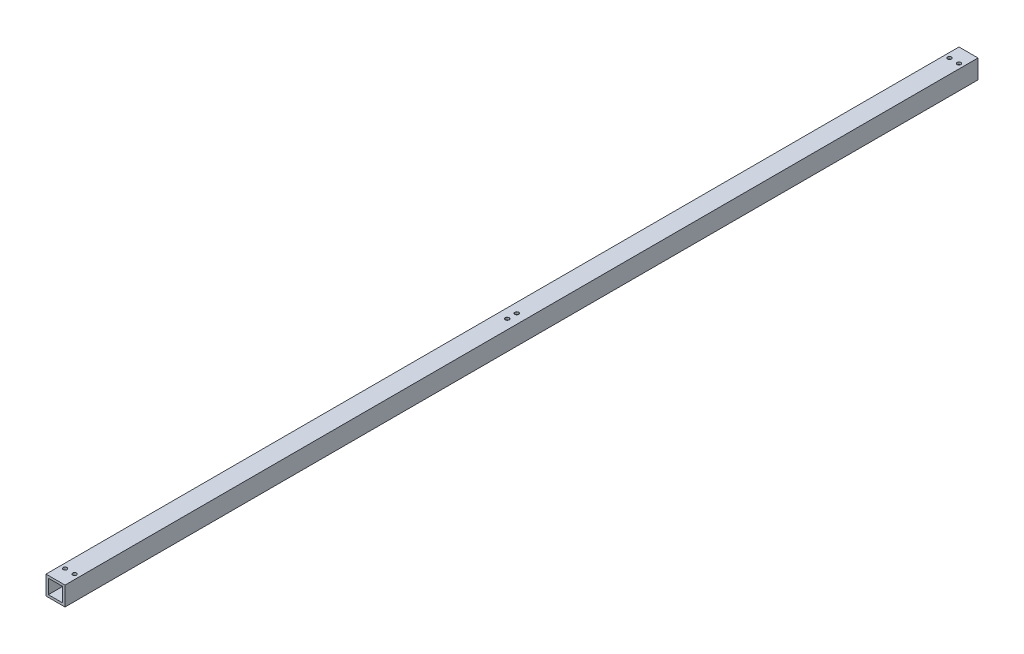
ISO-10303-21;
HEADER;
FILE_DESCRIPTION(('STEP AP214'),'2;1');
FILE_NAME('part.step','',(''),(''),'','','');
FILE_SCHEMA(('AUTOMOTIVE_DESIGN { 1 0 10303 214 1 1 1 1 }'));
ENDSEC;
DATA;
#1=APPLICATION_CONTEXT('core data for automotive mechanical design processes');
#2=APPLICATION_PROTOCOL_DEFINITION('international standard','automotive_design',2000,#1);
#3=PRODUCT_CONTEXT('',#1,'mechanical');
#4=PRODUCT('Part','Part','',(#3));
#5=PRODUCT_RELATED_PRODUCT_CATEGORY('part','',(#4));
#6=PRODUCT_DEFINITION_FORMATION('','',#4);
#7=PRODUCT_DEFINITION_CONTEXT('part definition',#1,'design');
#8=PRODUCT_DEFINITION('design','',#6,#7);
#9=PRODUCT_DEFINITION_SHAPE('','',#8);
#10=(LENGTH_UNIT() NAMED_UNIT(*) SI_UNIT(.MILLI.,.METRE.));
#11=(NAMED_UNIT(*) PLANE_ANGLE_UNIT() SI_UNIT($,.RADIAN.));
#12=(NAMED_UNIT(*) SI_UNIT($,.STERADIAN.) SOLID_ANGLE_UNIT());
#13=UNCERTAINTY_MEASURE_WITH_UNIT(LENGTH_MEASURE(1.E-05),#10,'distance_accuracy_value','');
#14=(GEOMETRIC_REPRESENTATION_CONTEXT(3) GLOBAL_UNCERTAINTY_ASSIGNED_CONTEXT((#13)) GLOBAL_UNIT_ASSIGNED_CONTEXT((#10,
#11,#12)) REPRESENTATION_CONTEXT('',''));
#15=CARTESIAN_POINT('',(0.,0.,0.));
#16=DIRECTION('',(0.,0.,1.));
#17=DIRECTION('',(1.,0.,0.));
#18=AXIS2_PLACEMENT_3D('',#15,#16,#17);
#19=CARTESIAN_POINT('',(50.8,96.52,-711.2));
#20=DIRECTION('',(-1.,0.,0.));
#21=DIRECTION('',(0.,0.,1.));
#22=AXIS2_PLACEMENT_3D('',#19,#20,#21);
#23=PLANE('',#22);
#24=DIRECTION('',(0.,-1.,0.));
#25=VECTOR('',#24,1.);
#26=CARTESIAN_POINT('',(50.8,96.52,508.));
#27=LINE('',#26,#25);
#28=CARTESIAN_POINT('',(50.8,96.52,508.));
#29=VERTEX_POINT('',#28);
#30=CARTESIAN_POINT('',(50.8,71.12,508.));
#31=VERTEX_POINT('',#30);
#32=EDGE_CURVE('E170',#29,#31,#27,.T.);
#33=ORIENTED_EDGE('',*,*,#32,.F.);
#34=DIRECTION('',(0.,0.,1.));
#35=VECTOR('',#34,1.);
#36=CARTESIAN_POINT('',(50.8,96.52,-711.2));
#37=LINE('',#36,#35);
#38=CARTESIAN_POINT('',(50.8,96.52,-711.2));
#39=VERTEX_POINT('',#38);
#40=EDGE_CURVE('E12',#39,#29,#37,.T.);
#41=ORIENTED_EDGE('',*,*,#40,.F.);
#42=DIRECTION('',(0.,-1.,0.));
#43=VECTOR('',#42,1.);
#44=CARTESIAN_POINT('',(50.8,96.52,-711.2));
#45=LINE('',#44,#43);
#46=CARTESIAN_POINT('',(50.8,71.12,-711.2));
#47=VERTEX_POINT('',#46);
#48=EDGE_CURVE('E174',#39,#47,#45,.T.);
#49=ORIENTED_EDGE('',*,*,#48,.T.);
#50=DIRECTION('',(0.,0.,1.));
#51=VECTOR('',#50,1.);
#52=CARTESIAN_POINT('',(50.8,71.12,-711.2));
#53=LINE('',#52,#51);
#54=EDGE_CURVE('E187',#47,#31,#53,.T.);
#55=ORIENTED_EDGE('',*,*,#54,.T.);
#56=EDGE_LOOP('',(#33,#41,#49,#55));
#57=FACE_BOUND('',#56,.T.);
#58=ADVANCED_FACE('F69',(#57),#23,.T.);
#59=CARTESIAN_POINT('',(50.8,96.52,-711.2));
#60=DIRECTION('',(0.,1.,0.));
#61=DIRECTION('',(0.,0.,1.));
#62=AXIS2_PLACEMENT_3D('',#59,#60,#61);
#63=PLANE('',#62);
#64=CARTESIAN_POINT('',(57.15,96.52,488.95));
#65=DIRECTION('',(0.,1.,0.));
#66=DIRECTION('',(0.,0.,1.));
#67=AXIS2_PLACEMENT_3D('',#64,#65,#66);
#68=CIRCLE('',#67,2.525);
#69=CARTESIAN_POINT('',(57.15,96.52,491.475));
#70=VERTEX_POINT('',#69);
#71=EDGE_CURVE('E396',#70,#70,#68,.T.);
#72=ORIENTED_EDGE('',*,*,#71,.F.);
#73=EDGE_LOOP('',(#72));
#74=FACE_BOUND('',#73,.T.);
#75=CARTESIAN_POINT('',(69.85,96.52,488.95));
#76=DIRECTION('',(0.,1.,0.));
#77=DIRECTION('',(0.,0.,1.));
#78=AXIS2_PLACEMENT_3D('',#75,#76,#77);
#79=CIRCLE('',#78,2.525);
#80=CARTESIAN_POINT('',(69.85,96.52,491.475));
#81=VERTEX_POINT('',#80);
#82=EDGE_CURVE('E407',#81,#81,#79,.T.);
#83=ORIENTED_EDGE('',*,*,#82,.F.);
#84=EDGE_LOOP('',(#83));
#85=FACE_BOUND('',#84,.T.);
#86=CARTESIAN_POINT('',(63.5,96.52,-107.95));
#87=DIRECTION('',(0.,1.,0.));
#88=DIRECTION('',(0.,0.,1.));
#89=AXIS2_PLACEMENT_3D('',#86,#87,#88);
#90=CIRCLE('',#89,2.525);
#91=CARTESIAN_POINT('',(63.5,96.52,-105.425));
#92=VERTEX_POINT('',#91);
#93=EDGE_CURVE('E221',#92,#92,#90,.T.);
#94=ORIENTED_EDGE('',*,*,#93,.F.);
#95=EDGE_LOOP('',(#94));
#96=FACE_BOUND('',#95,.T.);
#97=CARTESIAN_POINT('',(63.5000000000002,96.52,-95.25));
#98=DIRECTION('',(0.,1.,0.));
#99=DIRECTION('',(0.,0.,1.));
#100=AXIS2_PLACEMENT_3D('',#97,#98,#99);
#101=CIRCLE('',#100,2.525);
#102=CARTESIAN_POINT('',(63.5000000000002,96.52,-92.725));
#103=VERTEX_POINT('',#102);
#104=EDGE_CURVE('E213',#103,#103,#101,.T.);
#105=ORIENTED_EDGE('',*,*,#104,.F.);
#106=EDGE_LOOP('',(#105));
#107=FACE_BOUND('',#106,.T.);
#108=CARTESIAN_POINT('',(57.15,96.52,-692.15));
#109=DIRECTION('',(0.,1.,0.));
#110=DIRECTION('',(0.,0.,1.));
#111=AXIS2_PLACEMENT_3D('',#108,#109,#110);
#112=CIRCLE('',#111,2.525);
#113=CARTESIAN_POINT('',(57.15,96.52,-689.625));
#114=VERTEX_POINT('',#113);
#115=EDGE_CURVE('E239',#114,#114,#112,.T.);
#116=ORIENTED_EDGE('',*,*,#115,.F.);
#117=EDGE_LOOP('',(#116));
#118=FACE_BOUND('',#117,.T.);
#119=CARTESIAN_POINT('',(69.85,96.52,-692.15));
#120=DIRECTION('',(0.,1.,0.));
#121=DIRECTION('',(0.,0.,1.));
#122=AXIS2_PLACEMENT_3D('',#119,#120,#121);
#123=CIRCLE('',#122,2.525);
#124=CARTESIAN_POINT('',(69.85,96.52,-689.625));
#125=VERTEX_POINT('',#124);
#126=EDGE_CURVE('E249',#125,#125,#123,.T.);
#127=ORIENTED_EDGE('',*,*,#126,.F.);
#128=EDGE_LOOP('',(#127));
#129=FACE_BOUND('',#128,.T.);
#130=DIRECTION('',(-1.,0.,0.));
#131=VECTOR('',#130,1.);
#132=CARTESIAN_POINT('',(50.8,96.52,508.));
#133=LINE('',#132,#131);
#134=CARTESIAN_POINT('',(76.2,96.52,508.));
#135=VERTEX_POINT('',#134);
#136=EDGE_CURVE('E178',#135,#29,#133,.T.);
#137=ORIENTED_EDGE('',*,*,#136,.F.);
#138=DIRECTION('',(0.,0.,1.));
#139=VECTOR('',#138,1.);
#140=CARTESIAN_POINT('',(76.2,96.52,-711.2));
#141=LINE('',#140,#139);
#142=CARTESIAN_POINT('',(76.2,96.52,-711.2));
#143=VERTEX_POINT('',#142);
#144=EDGE_CURVE('E77',#143,#135,#141,.T.);
#145=ORIENTED_EDGE('',*,*,#144,.F.);
#146=DIRECTION('',(-1.,0.,0.));
#147=VECTOR('',#146,1.);
#148=CARTESIAN_POINT('',(50.8,96.52,-711.2));
#149=LINE('',#148,#147);
#150=EDGE_CURVE('E184',#143,#39,#149,.T.);
#151=ORIENTED_EDGE('',*,*,#150,.T.);
#152=ORIENTED_EDGE('',*,*,#40,.T.);
#153=EDGE_LOOP('',(#137,#145,#151,#152));
#154=FACE_BOUND('',#153,.T.);
#155=ADVANCED_FACE('F283',(#74,#85,#96,#107,#118,#129,#154),#63,.T.);
#156=CARTESIAN_POINT('',(76.2,71.12,-711.2));
#157=DIRECTION('',(1.,0.,0.));
#158=DIRECTION('',(0.,0.,-1.));
#159=AXIS2_PLACEMENT_3D('',#156,#157,#158);
#160=PLANE('',#159);
#161=DIRECTION('',(0.,1.,0.));
#162=VECTOR('',#161,1.);
#163=CARTESIAN_POINT('',(76.2,71.12,508.));
#164=LINE('',#163,#162);
#165=CARTESIAN_POINT('',(76.2,71.12,508.));
#166=VERTEX_POINT('',#165);
#167=EDGE_CURVE('E193',#166,#135,#164,.T.);
#168=ORIENTED_EDGE('',*,*,#167,.F.);
#169=DIRECTION('',(0.,0.,1.));
#170=VECTOR('',#169,1.);
#171=CARTESIAN_POINT('',(76.2,71.12,-711.2));
#172=LINE('',#171,#170);
#173=CARTESIAN_POINT('',(76.2,71.12,-711.2));
#174=VERTEX_POINT('',#173);
#175=EDGE_CURVE('E199',#174,#166,#172,.T.);
#176=ORIENTED_EDGE('',*,*,#175,.F.);
#177=DIRECTION('',(0.,1.,0.));
#178=VECTOR('',#177,1.);
#179=CARTESIAN_POINT('',(76.2,71.12,-711.2));
#180=LINE('',#179,#178);
#181=EDGE_CURVE('E181',#174,#143,#180,.T.);
#182=ORIENTED_EDGE('',*,*,#181,.T.);
#183=ORIENTED_EDGE('',*,*,#144,.T.);
#184=EDGE_LOOP('',(#168,#176,#182,#183));
#185=FACE_BOUND('',#184,.T.);
#186=ADVANCED_FACE('F289',(#185),#160,.T.);
#187=CARTESIAN_POINT('',(50.8,71.12,-711.2));
#188=DIRECTION('',(0.,-1.,0.));
#189=DIRECTION('',(0.,0.,-1.));
#190=AXIS2_PLACEMENT_3D('',#187,#188,#189);
#191=PLANE('',#190);
#192=CARTESIAN_POINT('',(57.15,71.12,488.95));
#193=DIRECTION('',(0.,1.,0.));
#194=DIRECTION('',(0.,0.,1.));
#195=AXIS2_PLACEMENT_3D('',#192,#193,#194);
#196=CIRCLE('',#195,2.5);
#197=CARTESIAN_POINT('',(57.15,71.12,491.45));
#198=VERTEX_POINT('',#197);
#199=EDGE_CURVE('E398',#198,#198,#196,.T.);
#200=ORIENTED_EDGE('',*,*,#199,.T.);
#201=EDGE_LOOP('',(#200));
#202=FACE_BOUND('',#201,.T.);
#203=CARTESIAN_POINT('',(69.85,71.12,488.95));
#204=DIRECTION('',(0.,1.,0.));
#205=DIRECTION('',(0.,0.,1.));
#206=AXIS2_PLACEMENT_3D('',#203,#204,#205);
#207=CIRCLE('',#206,2.49999999999999);
#208=CARTESIAN_POINT('',(69.85,71.12,491.45));
#209=VERTEX_POINT('',#208);
#210=EDGE_CURVE('E413',#209,#209,#207,.T.);
#211=ORIENTED_EDGE('',*,*,#210,.T.);
#212=EDGE_LOOP('',(#211));
#213=FACE_BOUND('',#212,.T.);
#214=CARTESIAN_POINT('',(63.5,71.12,-107.95));
#215=DIRECTION('',(0.,1.,0.));
#216=DIRECTION('',(0.,0.,1.));
#217=AXIS2_PLACEMENT_3D('',#214,#215,#216);
#218=CIRCLE('',#217,2.49999999999999);
#219=CARTESIAN_POINT('',(63.5,71.12,-105.45));
#220=VERTEX_POINT('',#219);
#221=EDGE_CURVE('E209',#220,#220,#218,.T.);
#222=ORIENTED_EDGE('',*,*,#221,.T.);
#223=EDGE_LOOP('',(#222));
#224=FACE_BOUND('',#223,.T.);
#225=CARTESIAN_POINT('',(63.5000000000002,71.12,-95.25));
#226=DIRECTION('',(0.,1.,0.));
#227=DIRECTION('',(0.,0.,1.));
#228=AXIS2_PLACEMENT_3D('',#225,#226,#227);
#229=CIRCLE('',#228,2.49999999999999);
#230=CARTESIAN_POINT('',(63.5000000000002,71.12,-92.75));
#231=VERTEX_POINT('',#230);
#232=EDGE_CURVE('E230',#231,#231,#229,.T.);
#233=ORIENTED_EDGE('',*,*,#232,.T.);
#234=EDGE_LOOP('',(#233));
#235=FACE_BOUND('',#234,.T.);
#236=CARTESIAN_POINT('',(57.15,71.12,-692.15));
#237=DIRECTION('',(0.,1.,0.));
#238=DIRECTION('',(0.,0.,1.));
#239=AXIS2_PLACEMENT_3D('',#236,#237,#238);
#240=CIRCLE('',#239,2.5);
#241=CARTESIAN_POINT('',(57.15,71.12,-689.65));
#242=VERTEX_POINT('',#241);
#243=EDGE_CURVE('E205',#242,#242,#240,.T.);
#244=ORIENTED_EDGE('',*,*,#243,.T.);
#245=EDGE_LOOP('',(#244));
#246=FACE_BOUND('',#245,.T.);
#247=CARTESIAN_POINT('',(69.85,71.12,-692.15));
#248=DIRECTION('',(0.,1.,0.));
#249=DIRECTION('',(0.,0.,1.));
#250=AXIS2_PLACEMENT_3D('',#247,#248,#249);
#251=CIRCLE('',#250,2.49999999999999);
#252=CARTESIAN_POINT('',(69.85,71.12,-689.65));
#253=VERTEX_POINT('',#252);
#254=EDGE_CURVE('E255',#253,#253,#251,.T.);
#255=ORIENTED_EDGE('',*,*,#254,.T.);
#256=EDGE_LOOP('',(#255));
#257=FACE_BOUND('',#256,.T.);
#258=DIRECTION('',(1.,0.,0.));
#259=VECTOR('',#258,1.);
#260=CARTESIAN_POINT('',(50.8,71.12,508.));
#261=LINE('',#260,#259);
#262=EDGE_CURVE('E190',#31,#166,#261,.T.);
#263=ORIENTED_EDGE('',*,*,#262,.F.);
#264=ORIENTED_EDGE('',*,*,#54,.F.);
#265=DIRECTION('',(1.,0.,0.));
#266=VECTOR('',#265,1.);
#267=CARTESIAN_POINT('',(50.8,71.12,-711.2));
#268=LINE('',#267,#266);
#269=EDGE_CURVE('E177',#47,#174,#268,.T.);
#270=ORIENTED_EDGE('',*,*,#269,.T.);
#271=ORIENTED_EDGE('',*,*,#175,.T.);
#272=EDGE_LOOP('',(#263,#264,#270,#271));
#273=FACE_BOUND('',#272,.T.);
#274=ADVANCED_FACE('F304',(#202,#213,#224,#235,#246,#257,#273),#191,.T.);
#275=CARTESIAN_POINT('',(0.,0.,-711.2));
#276=DIRECTION('',(0.,0.,1.));
#277=DIRECTION('',(1.,0.,0.));
#278=AXIS2_PLACEMENT_3D('',#275,#276,#277);
#279=PLANE('',#278);
#280=DIRECTION('',(-1.,0.,0.));
#281=VECTOR('',#280,1.);
#282=CARTESIAN_POINT('',(50.8,93.345,-711.2));
#283=LINE('',#282,#281);
#284=CARTESIAN_POINT('',(73.025,93.345,-711.2));
#285=VERTEX_POINT('',#284);
#286=CARTESIAN_POINT('',(53.975,93.345,-711.2));
#287=VERTEX_POINT('',#286);
#288=EDGE_CURVE('E142',#285,#287,#283,.T.);
#289=ORIENTED_EDGE('',*,*,#288,.T.);
#290=DIRECTION('',(0.,-1.,0.));
#291=VECTOR('',#290,1.);
#292=CARTESIAN_POINT('',(53.975,96.52,-711.2));
#293=LINE('',#292,#291);
#294=CARTESIAN_POINT('',(53.975,74.295,-711.2));
#295=VERTEX_POINT('',#294);
#296=EDGE_CURVE('E136',#287,#295,#293,.T.);
#297=ORIENTED_EDGE('',*,*,#296,.T.);
#298=DIRECTION('',(1.,0.,0.));
#299=VECTOR('',#298,1.);
#300=CARTESIAN_POINT('',(50.8,74.295,-711.2));
#301=LINE('',#300,#299);
#302=CARTESIAN_POINT('',(73.025,74.295,-711.2));
#303=VERTEX_POINT('',#302);
#304=EDGE_CURVE('E145',#295,#303,#301,.T.);
#305=ORIENTED_EDGE('',*,*,#304,.T.);
#306=DIRECTION('',(0.,1.,0.));
#307=VECTOR('',#306,1.);
#308=CARTESIAN_POINT('',(73.025,71.12,-711.2));
#309=LINE('',#308,#307);
#310=EDGE_CURVE('E85',#303,#285,#309,.T.);
#311=ORIENTED_EDGE('',*,*,#310,.T.);
#312=EDGE_LOOP('',(#289,#297,#305,#311));
#313=FACE_BOUND('',#312,.T.);
#314=ORIENTED_EDGE('',*,*,#48,.F.);
#315=ORIENTED_EDGE('',*,*,#150,.F.);
#316=ORIENTED_EDGE('',*,*,#181,.F.);
#317=ORIENTED_EDGE('',*,*,#269,.F.);
#318=EDGE_LOOP('',(#314,#315,#316,#317));
#319=FACE_BOUND('',#318,.T.);
#320=ADVANCED_FACE('F149',(#313,#319),#279,.F.);
#321=CARTESIAN_POINT('',(0.,0.,508.));
#322=DIRECTION('',(0.,0.,1.));
#323=DIRECTION('',(1.,0.,0.));
#324=AXIS2_PLACEMENT_3D('',#321,#322,#323);
#325=PLANE('',#324);
#326=DIRECTION('',(0.,-1.,0.));
#327=VECTOR('',#326,1.);
#328=CARTESIAN_POINT('',(53.975,96.52,508.));
#329=LINE('',#328,#327);
#330=CARTESIAN_POINT('',(53.975,93.345,508.));
#331=VERTEX_POINT('',#330);
#332=CARTESIAN_POINT('',(53.975,74.295,508.));
#333=VERTEX_POINT('',#332);
#334=EDGE_CURVE('E93',#331,#333,#329,.T.);
#335=ORIENTED_EDGE('',*,*,#334,.F.);
#336=DIRECTION('',(-1.,0.,0.));
#337=VECTOR('',#336,1.);
#338=CARTESIAN_POINT('',(50.8,93.345,508.));
#339=LINE('',#338,#337);
#340=CARTESIAN_POINT('',(73.025,93.345,508.));
#341=VERTEX_POINT('',#340);
#342=EDGE_CURVE('E152',#341,#331,#339,.T.);
#343=ORIENTED_EDGE('',*,*,#342,.F.);
#344=DIRECTION('',(0.,1.,0.));
#345=VECTOR('',#344,1.);
#346=CARTESIAN_POINT('',(73.025,71.12,508.));
#347=LINE('',#346,#345);
#348=CARTESIAN_POINT('',(73.025,74.295,508.));
#349=VERTEX_POINT('',#348);
#350=EDGE_CURVE('E155',#349,#341,#347,.T.);
#351=ORIENTED_EDGE('',*,*,#350,.F.);
#352=DIRECTION('',(1.,0.,0.));
#353=VECTOR('',#352,1.);
#354=CARTESIAN_POINT('',(50.8,74.295,508.));
#355=LINE('',#354,#353);
#356=EDGE_CURVE('E164',#333,#349,#355,.T.);
#357=ORIENTED_EDGE('',*,*,#356,.F.);
#358=EDGE_LOOP('',(#335,#343,#351,#357));
#359=FACE_BOUND('',#358,.T.);
#360=ORIENTED_EDGE('',*,*,#32,.T.);
#361=ORIENTED_EDGE('',*,*,#262,.T.);
#362=ORIENTED_EDGE('',*,*,#167,.T.);
#363=ORIENTED_EDGE('',*,*,#136,.T.);
#364=EDGE_LOOP('',(#360,#361,#362,#363));
#365=FACE_BOUND('',#364,.T.);
#366=ADVANCED_FACE('F297',(#359,#365),#325,.T.);
#367=CARTESIAN_POINT('',(53.975,96.52,-711.2));
#368=DIRECTION('',(-1.,0.,0.));
#369=DIRECTION('',(0.,0.,1.));
#370=AXIS2_PLACEMENT_3D('',#367,#368,#369);
#371=PLANE('',#370);
#372=ORIENTED_EDGE('',*,*,#334,.T.);
#373=DIRECTION('',(0.,0.,1.));
#374=VECTOR('',#373,1.);
#375=CARTESIAN_POINT('',(53.975,74.295,-711.2));
#376=LINE('',#375,#374);
#377=EDGE_CURVE('E132',#295,#333,#376,.T.);
#378=ORIENTED_EDGE('',*,*,#377,.F.);
#379=ORIENTED_EDGE('',*,*,#296,.F.);
#380=DIRECTION('',(0.,0.,1.));
#381=VECTOR('',#380,1.);
#382=CARTESIAN_POINT('',(53.975,93.345,-711.2));
#383=LINE('',#382,#381);
#384=EDGE_CURVE('E168',#287,#331,#383,.T.);
#385=ORIENTED_EDGE('',*,*,#384,.T.);
#386=EDGE_LOOP('',(#372,#378,#379,#385));
#387=FACE_BOUND('',#386,.T.);
#388=ADVANCED_FACE('F134',(#387),#371,.F.);
#389=CARTESIAN_POINT('',(50.8,93.345,-711.2));
#390=DIRECTION('',(0.,1.,0.));
#391=DIRECTION('',(0.,0.,1.));
#392=AXIS2_PLACEMENT_3D('',#389,#390,#391);
#393=PLANE('',#392);
#394=CARTESIAN_POINT('',(57.15,93.345,488.95));
#395=DIRECTION('',(0.,1.,0.));
#396=DIRECTION('',(0.,0.,1.));
#397=AXIS2_PLACEMENT_3D('',#394,#395,#396);
#398=CIRCLE('',#397,2.49999999999999);
#399=CARTESIAN_POINT('',(57.15,93.345,491.45));
#400=VERTEX_POINT('',#399);
#401=EDGE_CURVE('E331',#400,#400,#398,.T.);
#402=ORIENTED_EDGE('',*,*,#401,.T.);
#403=EDGE_LOOP('',(#402));
#404=FACE_BOUND('',#403,.T.);
#405=CARTESIAN_POINT('',(69.85,93.345,488.95));
#406=DIRECTION('',(0.,1.,0.));
#407=DIRECTION('',(0.,0.,1.));
#408=AXIS2_PLACEMENT_3D('',#405,#406,#407);
#409=CIRCLE('',#408,2.49999999999999);
#410=CARTESIAN_POINT('',(69.85,93.345,491.45));
#411=VERTEX_POINT('',#410);
#412=EDGE_CURVE('E334',#411,#411,#409,.T.);
#413=ORIENTED_EDGE('',*,*,#412,.T.);
#414=EDGE_LOOP('',(#413));
#415=FACE_BOUND('',#414,.T.);
#416=CARTESIAN_POINT('',(63.5,93.345,-107.95));
#417=DIRECTION('',(0.,1.,0.));
#418=DIRECTION('',(0.,0.,1.));
#419=AXIS2_PLACEMENT_3D('',#416,#417,#418);
#420=CIRCLE('',#419,2.49999999999999);
#421=CARTESIAN_POINT('',(63.5,93.345,-105.45));
#422=VERTEX_POINT('',#421);
#423=EDGE_CURVE('E206',#422,#422,#420,.T.);
#424=ORIENTED_EDGE('',*,*,#423,.T.);
#425=EDGE_LOOP('',(#424));
#426=FACE_BOUND('',#425,.T.);
#427=CARTESIAN_POINT('',(63.5000000000002,93.345,-95.25));
#428=DIRECTION('',(0.,1.,0.));
#429=DIRECTION('',(0.,0.,1.));
#430=AXIS2_PLACEMENT_3D('',#427,#428,#429);
#431=CIRCLE('',#430,2.49999999999999);
#432=CARTESIAN_POINT('',(63.5000000000002,93.345,-92.75));
#433=VERTEX_POINT('',#432);
#434=EDGE_CURVE('E236',#433,#433,#431,.T.);
#435=ORIENTED_EDGE('',*,*,#434,.T.);
#436=EDGE_LOOP('',(#435));
#437=FACE_BOUND('',#436,.T.);
#438=CARTESIAN_POINT('',(57.15,93.345,-692.15));
#439=DIRECTION('',(0.,1.,0.));
#440=DIRECTION('',(0.,0.,1.));
#441=AXIS2_PLACEMENT_3D('',#438,#439,#440);
#442=CIRCLE('',#441,2.49999999999999);
#443=CARTESIAN_POINT('',(57.15,93.345,-689.65));
#444=VERTEX_POINT('',#443);
#445=EDGE_CURVE('E204',#444,#444,#442,.T.);
#446=ORIENTED_EDGE('',*,*,#445,.T.);
#447=EDGE_LOOP('',(#446));
#448=FACE_BOUND('',#447,.T.);
#449=CARTESIAN_POINT('',(69.85,93.345,-692.15));
#450=DIRECTION('',(0.,1.,0.));
#451=DIRECTION('',(0.,0.,1.));
#452=AXIS2_PLACEMENT_3D('',#449,#450,#451);
#453=CIRCLE('',#452,2.49999999999999);
#454=CARTESIAN_POINT('',(69.85,93.345,-689.65));
#455=VERTEX_POINT('',#454);
#456=EDGE_CURVE('E158',#455,#455,#453,.T.);
#457=ORIENTED_EDGE('',*,*,#456,.T.);
#458=EDGE_LOOP('',(#457));
#459=FACE_BOUND('',#458,.T.);
#460=ORIENTED_EDGE('',*,*,#342,.T.);
#461=ORIENTED_EDGE('',*,*,#384,.F.);
#462=ORIENTED_EDGE('',*,*,#288,.F.);
#463=DIRECTION('',(0.,0.,1.));
#464=VECTOR('',#463,1.);
#465=CARTESIAN_POINT('',(73.025,93.345,-711.2));
#466=LINE('',#465,#464);
#467=EDGE_CURVE('E171',#285,#341,#466,.T.);
#468=ORIENTED_EDGE('',*,*,#467,.T.);
#469=EDGE_LOOP('',(#460,#461,#462,#468));
#470=FACE_BOUND('',#469,.T.);
#471=ADVANCED_FACE('F264',(#404,#415,#426,#437,#448,#459,#470),#393,.F.);
#472=CARTESIAN_POINT('',(73.025,71.12,-711.2));
#473=DIRECTION('',(1.,0.,0.));
#474=DIRECTION('',(0.,0.,-1.));
#475=AXIS2_PLACEMENT_3D('',#472,#473,#474);
#476=PLANE('',#475);
#477=ORIENTED_EDGE('',*,*,#350,.T.);
#478=ORIENTED_EDGE('',*,*,#467,.F.);
#479=ORIENTED_EDGE('',*,*,#310,.F.);
#480=DIRECTION('',(0.,0.,1.));
#481=VECTOR('',#480,1.);
#482=CARTESIAN_POINT('',(73.025,74.295,-711.2));
#483=LINE('',#482,#481);
#484=EDGE_CURVE('E141',#303,#349,#483,.T.);
#485=ORIENTED_EDGE('',*,*,#484,.T.);
#486=EDGE_LOOP('',(#477,#478,#479,#485));
#487=FACE_BOUND('',#486,.T.);
#488=ADVANCED_FACE('F321',(#487),#476,.F.);
#489=CARTESIAN_POINT('',(50.8,74.295,-711.2));
#490=DIRECTION('',(0.,-1.,0.));
#491=DIRECTION('',(0.,0.,-1.));
#492=AXIS2_PLACEMENT_3D('',#489,#490,#491);
#493=PLANE('',#492);
#494=CARTESIAN_POINT('',(57.15,74.295,488.95));
#495=DIRECTION('',(0.,-1.,0.));
#496=DIRECTION('',(0.,0.,-1.));
#497=AXIS2_PLACEMENT_3D('',#494,#495,#496);
#498=CIRCLE('',#497,2.49999999999999);
#499=CARTESIAN_POINT('',(57.15,74.295,486.45));
#500=VERTEX_POINT('',#499);
#501=EDGE_CURVE('E403',#500,#500,#498,.T.);
#502=ORIENTED_EDGE('',*,*,#501,.T.);
#503=EDGE_LOOP('',(#502));
#504=FACE_BOUND('',#503,.T.);
#505=CARTESIAN_POINT('',(69.85,74.295,488.95));
#506=DIRECTION('',(0.,-1.,0.));
#507=DIRECTION('',(0.,0.,-1.));
#508=AXIS2_PLACEMENT_3D('',#505,#506,#507);
#509=CIRCLE('',#508,2.49999999999999);
#510=CARTESIAN_POINT('',(69.85,74.295,486.45));
#511=VERTEX_POINT('',#510);
#512=EDGE_CURVE('E72',#511,#511,#509,.T.);
#513=ORIENTED_EDGE('',*,*,#512,.T.);
#514=EDGE_LOOP('',(#513));
#515=FACE_BOUND('',#514,.T.);
#516=CARTESIAN_POINT('',(63.5,74.295,-107.95));
#517=DIRECTION('',(0.,-1.,0.));
#518=DIRECTION('',(0.,0.,-1.));
#519=AXIS2_PLACEMENT_3D('',#516,#517,#518);
#520=CIRCLE('',#519,2.49999999999999);
#521=CARTESIAN_POINT('',(63.5,74.295,-110.45));
#522=VERTEX_POINT('',#521);
#523=EDGE_CURVE('E208',#522,#522,#520,.T.);
#524=ORIENTED_EDGE('',*,*,#523,.T.);
#525=EDGE_LOOP('',(#524));
#526=FACE_BOUND('',#525,.T.);
#527=CARTESIAN_POINT('',(63.5000000000002,74.295,-95.25));
#528=DIRECTION('',(0.,-1.,0.));
#529=DIRECTION('',(0.,0.,-1.));
#530=AXIS2_PLACEMENT_3D('',#527,#528,#529);
#531=CIRCLE('',#530,2.49999999999999);
#532=CARTESIAN_POINT('',(63.5000000000002,74.295,-97.75));
#533=VERTEX_POINT('',#532);
#534=EDGE_CURVE('E233',#533,#533,#531,.T.);
#535=ORIENTED_EDGE('',*,*,#534,.T.);
#536=EDGE_LOOP('',(#535));
#537=FACE_BOUND('',#536,.T.);
#538=CARTESIAN_POINT('',(57.15,74.295,-692.15));
#539=DIRECTION('',(0.,-1.,0.));
#540=DIRECTION('',(0.,0.,-1.));
#541=AXIS2_PLACEMENT_3D('',#538,#539,#540);
#542=CIRCLE('',#541,2.49999999999999);
#543=CARTESIAN_POINT('',(57.15,74.295,-694.65));
#544=VERTEX_POINT('',#543);
#545=EDGE_CURVE('E202',#544,#544,#542,.T.);
#546=ORIENTED_EDGE('',*,*,#545,.T.);
#547=EDGE_LOOP('',(#546));
#548=FACE_BOUND('',#547,.T.);
#549=CARTESIAN_POINT('',(69.85,74.295,-692.15));
#550=DIRECTION('',(0.,-1.,0.));
#551=DIRECTION('',(0.,0.,-1.));
#552=AXIS2_PLACEMENT_3D('',#549,#550,#551);
#553=CIRCLE('',#552,2.49999999999999);
#554=CARTESIAN_POINT('',(69.85,74.295,-694.65));
#555=VERTEX_POINT('',#554);
#556=EDGE_CURVE('E257',#555,#555,#553,.T.);
#557=ORIENTED_EDGE('',*,*,#556,.T.);
#558=EDGE_LOOP('',(#557));
#559=FACE_BOUND('',#558,.T.);
#560=ORIENTED_EDGE('',*,*,#356,.T.);
#561=ORIENTED_EDGE('',*,*,#484,.F.);
#562=ORIENTED_EDGE('',*,*,#304,.F.);
#563=ORIENTED_EDGE('',*,*,#377,.T.);
#564=EDGE_LOOP('',(#560,#561,#562,#563));
#565=FACE_BOUND('',#564,.T.);
#566=ADVANCED_FACE('F146',(#504,#515,#526,#537,#548,#559,#565),#493,.F.);
#567=CARTESIAN_POINT('',(69.85,96.52,-692.15));
#568=DIRECTION('',(0.,1.,0.));
#569=DIRECTION('',(0.,0.,1.));
#570=AXIS2_PLACEMENT_3D('',#567,#568,#569);
#571=CYLINDRICAL_SURFACE('',#570,2.49999999999999);
#572=ORIENTED_EDGE('',*,*,#254,.F.);
#573=EDGE_LOOP('',(#572));
#574=FACE_BOUND('',#573,.T.);
#575=ORIENTED_EDGE('',*,*,#556,.F.);
#576=EDGE_LOOP('',(#575));
#577=FACE_BOUND('',#576,.T.);
#578=ADVANCED_FACE('F270',(#574,#577),#571,.F.);
#579=CARTESIAN_POINT('',(69.85,96.495,-692.15));
#580=DIRECTION('',(0.,1.,0.));
#581=DIRECTION('',(0.,0.,1.));
#582=AXIS2_PLACEMENT_3D('',#579,#580,#581);
#583=CIRCLE('',#582,2.49999999999999);
#584=CARTESIAN_POINT('',(69.85,96.495,-689.65));
#585=VERTEX_POINT('',#584);
#586=EDGE_CURVE('E252',#585,#585,#583,.T.);
#587=ORIENTED_EDGE('',*,*,#586,.T.);
#588=EDGE_LOOP('',(#587));
#589=FACE_BOUND('',#588,.T.);
#590=ORIENTED_EDGE('',*,*,#456,.F.);
#591=EDGE_LOOP('',(#590));
#592=FACE_BOUND('',#591,.T.);
#593=ADVANCED_FACE('F267',(#589,#592),#571,.F.);
#594=CARTESIAN_POINT('',(69.85,96.52,-692.15));
#595=DIRECTION('',(0.,1.,0.));
#596=DIRECTION('',(0.,0.,1.));
#597=AXIS2_PLACEMENT_3D('',#594,#595,#596);
#598=CONICAL_SURFACE('',#597,2.525,0.785398163397171);
#599=ORIENTED_EDGE('',*,*,#586,.F.);
#600=EDGE_LOOP('',(#599));
#601=FACE_BOUND('',#600,.T.);
#602=ORIENTED_EDGE('',*,*,#126,.T.);
#603=EDGE_LOOP('',(#602));
#604=FACE_BOUND('',#603,.T.);
#605=ADVANCED_FACE('F269',(#601,#604),#598,.F.);
#606=CARTESIAN_POINT('',(57.15,96.52,-692.15));
#607=DIRECTION('',(0.,1.,0.));
#608=DIRECTION('',(0.,0.,1.));
#609=AXIS2_PLACEMENT_3D('',#606,#607,#608);
#610=CYLINDRICAL_SURFACE('',#609,2.49999999999999);
#611=ORIENTED_EDGE('',*,*,#243,.F.);
#612=EDGE_LOOP('',(#611));
#613=FACE_BOUND('',#612,.T.);
#614=ORIENTED_EDGE('',*,*,#545,.F.);
#615=EDGE_LOOP('',(#614));
#616=FACE_BOUND('',#615,.T.);
#617=ADVANCED_FACE('F277',(#613,#616),#610,.F.);
#618=CARTESIAN_POINT('',(57.15,96.495,-692.15));
#619=DIRECTION('',(0.,1.,0.));
#620=DIRECTION('',(0.,0.,1.));
#621=AXIS2_PLACEMENT_3D('',#618,#619,#620);
#622=CIRCLE('',#621,2.49999999999999);
#623=CARTESIAN_POINT('',(57.15,96.495,-689.65));
#624=VERTEX_POINT('',#623);
#625=EDGE_CURVE('E242',#624,#624,#622,.T.);
#626=ORIENTED_EDGE('',*,*,#625,.T.);
#627=EDGE_LOOP('',(#626));
#628=FACE_BOUND('',#627,.T.);
#629=ORIENTED_EDGE('',*,*,#445,.F.);
#630=EDGE_LOOP('',(#629));
#631=FACE_BOUND('',#630,.T.);
#632=ADVANCED_FACE('F340',(#628,#631),#610,.F.);
#633=CARTESIAN_POINT('',(57.15,96.52,-692.15));
#634=DIRECTION('',(0.,1.,0.));
#635=DIRECTION('',(0.,0.,1.));
#636=AXIS2_PLACEMENT_3D('',#633,#634,#635);
#637=CONICAL_SURFACE('',#636,2.525,0.785398163397171);
#638=ORIENTED_EDGE('',*,*,#625,.F.);
#639=EDGE_LOOP('',(#638));
#640=FACE_BOUND('',#639,.T.);
#641=ORIENTED_EDGE('',*,*,#115,.T.);
#642=EDGE_LOOP('',(#641));
#643=FACE_BOUND('',#642,.T.);
#644=ADVANCED_FACE('F342',(#640,#643),#637,.F.);
#645=CARTESIAN_POINT('',(63.5000000000002,96.52,-95.25));
#646=DIRECTION('',(0.,1.,0.));
#647=DIRECTION('',(0.,0.,1.));
#648=AXIS2_PLACEMENT_3D('',#645,#646,#647);
#649=CYLINDRICAL_SURFACE('',#648,2.49999999999999);
#650=ORIENTED_EDGE('',*,*,#232,.F.);
#651=EDGE_LOOP('',(#650));
#652=FACE_BOUND('',#651,.T.);
#653=ORIENTED_EDGE('',*,*,#534,.F.);
#654=EDGE_LOOP('',(#653));
#655=FACE_BOUND('',#654,.T.);
#656=ADVANCED_FACE('F349',(#652,#655),#649,.F.);
#657=CARTESIAN_POINT('',(63.5000000000002,96.495,-95.25));
#658=DIRECTION('',(0.,1.,0.));
#659=DIRECTION('',(0.,0.,1.));
#660=AXIS2_PLACEMENT_3D('',#657,#658,#659);
#661=CIRCLE('',#660,2.49999999999999);
#662=CARTESIAN_POINT('',(63.5000000000002,96.495,-92.75));
#663=VERTEX_POINT('',#662);
#664=EDGE_CURVE('E227',#663,#663,#661,.T.);
#665=ORIENTED_EDGE('',*,*,#664,.T.);
#666=EDGE_LOOP('',(#665));
#667=FACE_BOUND('',#666,.T.);
#668=ORIENTED_EDGE('',*,*,#434,.F.);
#669=EDGE_LOOP('',(#668));
#670=FACE_BOUND('',#669,.T.);
#671=ADVANCED_FACE('F354',(#667,#670),#649,.F.);
#672=CARTESIAN_POINT('',(63.5000000000002,96.52,-95.25));
#673=DIRECTION('',(0.,1.,0.));
#674=DIRECTION('',(0.,0.,1.));
#675=AXIS2_PLACEMENT_3D('',#672,#673,#674);
#676=CONICAL_SURFACE('',#675,2.525,0.785398163397171);
#677=ORIENTED_EDGE('',*,*,#664,.F.);
#678=EDGE_LOOP('',(#677));
#679=FACE_BOUND('',#678,.T.);
#680=ORIENTED_EDGE('',*,*,#104,.T.);
#681=EDGE_LOOP('',(#680));
#682=FACE_BOUND('',#681,.T.);
#683=ADVANCED_FACE('F357',(#679,#682),#676,.F.);
#684=CARTESIAN_POINT('',(63.5,96.52,-107.95));
#685=DIRECTION('',(0.,1.,0.));
#686=DIRECTION('',(0.,0.,1.));
#687=AXIS2_PLACEMENT_3D('',#684,#685,#686);
#688=CONICAL_SURFACE('',#687,2.525,0.785398163397171);
#689=CARTESIAN_POINT('',(63.5,96.495,-107.95));
#690=DIRECTION('',(0.,1.,0.));
#691=DIRECTION('',(0.,0.,1.));
#692=AXIS2_PLACEMENT_3D('',#689,#690,#691);
#693=CIRCLE('',#692,2.49999999999999);
#694=CARTESIAN_POINT('',(63.5,96.495,-105.45));
#695=VERTEX_POINT('',#694);
#696=EDGE_CURVE('E216',#695,#695,#693,.T.);
#697=ORIENTED_EDGE('',*,*,#696,.F.);
#698=EDGE_LOOP('',(#697));
#699=FACE_BOUND('',#698,.T.);
#700=ORIENTED_EDGE('',*,*,#93,.T.);
#701=EDGE_LOOP('',(#700));
#702=FACE_BOUND('',#701,.T.);
#703=ADVANCED_FACE('F361',(#699,#702),#688,.F.);
#704=CARTESIAN_POINT('',(63.5,96.52,-107.95));
#705=DIRECTION('',(0.,1.,0.));
#706=DIRECTION('',(0.,0.,1.));
#707=AXIS2_PLACEMENT_3D('',#704,#705,#706);
#708=CYLINDRICAL_SURFACE('',#707,2.49999999999999);
#709=ORIENTED_EDGE('',*,*,#696,.T.);
#710=EDGE_LOOP('',(#709));
#711=FACE_BOUND('',#710,.T.);
#712=ORIENTED_EDGE('',*,*,#423,.F.);
#713=EDGE_LOOP('',(#712));
#714=FACE_BOUND('',#713,.T.);
#715=ADVANCED_FACE('F367',(#711,#714),#708,.F.);
#716=ORIENTED_EDGE('',*,*,#221,.F.);
#717=EDGE_LOOP('',(#716));
#718=FACE_BOUND('',#717,.T.);
#719=ORIENTED_EDGE('',*,*,#523,.F.);
#720=EDGE_LOOP('',(#719));
#721=FACE_BOUND('',#720,.T.);
#722=ADVANCED_FACE('F363',(#718,#721),#708,.F.);
#723=CARTESIAN_POINT('',(69.85,96.52,488.95));
#724=DIRECTION('',(0.,1.,0.));
#725=DIRECTION('',(0.,0.,1.));
#726=AXIS2_PLACEMENT_3D('',#723,#724,#725);
#727=CYLINDRICAL_SURFACE('',#726,2.49999999999999);
#728=ORIENTED_EDGE('',*,*,#210,.F.);
#729=EDGE_LOOP('',(#728));
#730=FACE_BOUND('',#729,.T.);
#731=ORIENTED_EDGE('',*,*,#512,.F.);
#732=EDGE_LOOP('',(#731));
#733=FACE_BOUND('',#732,.T.);
#734=ADVANCED_FACE('F366',(#730,#733),#727,.F.);
#735=CARTESIAN_POINT('',(69.85,96.495,488.95));
#736=DIRECTION('',(0.,1.,0.));
#737=DIRECTION('',(0.,0.,1.));
#738=AXIS2_PLACEMENT_3D('',#735,#736,#737);
#739=CIRCLE('',#738,2.49999999999999);
#740=CARTESIAN_POINT('',(69.85,96.495,491.45));
#741=VERTEX_POINT('',#740);
#742=EDGE_CURVE('E410',#741,#741,#739,.T.);
#743=ORIENTED_EDGE('',*,*,#742,.T.);
#744=EDGE_LOOP('',(#743));
#745=FACE_BOUND('',#744,.T.);
#746=ORIENTED_EDGE('',*,*,#412,.F.);
#747=EDGE_LOOP('',(#746));
#748=FACE_BOUND('',#747,.T.);
#749=ADVANCED_FACE('F372',(#745,#748),#727,.F.);
#750=CARTESIAN_POINT('',(69.85,96.52,488.95));
#751=DIRECTION('',(0.,1.,0.));
#752=DIRECTION('',(0.,0.,1.));
#753=AXIS2_PLACEMENT_3D('',#750,#751,#752);
#754=CONICAL_SURFACE('',#753,2.525,0.785398163397171);
#755=ORIENTED_EDGE('',*,*,#742,.F.);
#756=EDGE_LOOP('',(#755));
#757=FACE_BOUND('',#756,.T.);
#758=ORIENTED_EDGE('',*,*,#82,.T.);
#759=EDGE_LOOP('',(#758));
#760=FACE_BOUND('',#759,.T.);
#761=ADVANCED_FACE('F375',(#757,#760),#754,.F.);
#762=CARTESIAN_POINT('',(57.15,96.52,488.95));
#763=DIRECTION('',(0.,1.,0.));
#764=DIRECTION('',(0.,0.,1.));
#765=AXIS2_PLACEMENT_3D('',#762,#763,#764);
#766=CYLINDRICAL_SURFACE('',#765,2.49999999999999);
#767=ORIENTED_EDGE('',*,*,#199,.F.);
#768=EDGE_LOOP('',(#767));
#769=FACE_BOUND('',#768,.T.);
#770=ORIENTED_EDGE('',*,*,#501,.F.);
#771=EDGE_LOOP('',(#770));
#772=FACE_BOUND('',#771,.T.);
#773=ADVANCED_FACE('F379',(#769,#772),#766,.F.);
#774=CARTESIAN_POINT('',(57.15,96.495,488.95));
#775=DIRECTION('',(0.,1.,0.));
#776=DIRECTION('',(0.,0.,1.));
#777=AXIS2_PLACEMENT_3D('',#774,#775,#776);
#778=CIRCLE('',#777,2.49999999999999);
#779=CARTESIAN_POINT('',(57.15,96.495,491.45));
#780=VERTEX_POINT('',#779);
#781=EDGE_CURVE('E393',#780,#780,#778,.T.);
#782=ORIENTED_EDGE('',*,*,#781,.T.);
#783=EDGE_LOOP('',(#782));
#784=FACE_BOUND('',#783,.T.);
#785=ORIENTED_EDGE('',*,*,#401,.F.);
#786=EDGE_LOOP('',(#785));
#787=FACE_BOUND('',#786,.T.);
#788=ADVANCED_FACE('F381',(#784,#787),#766,.F.);
#789=CARTESIAN_POINT('',(57.15,96.52,488.95));
#790=DIRECTION('',(0.,1.,0.));
#791=DIRECTION('',(0.,0.,1.));
#792=AXIS2_PLACEMENT_3D('',#789,#790,#791);
#793=CONICAL_SURFACE('',#792,2.525,0.785398163397171);
#794=ORIENTED_EDGE('',*,*,#781,.F.);
#795=EDGE_LOOP('',(#794));
#796=FACE_BOUND('',#795,.T.);
#797=ORIENTED_EDGE('',*,*,#71,.T.);
#798=EDGE_LOOP('',(#797));
#799=FACE_BOUND('',#798,.T.);
#800=ADVANCED_FACE('F384',(#796,#799),#793,.F.);
#801=CLOSED_SHELL('',(#58,#155,#186,#274,#320,#366,#388,#471,#488,#566,#578,#593,#605,#617,#632,
#644,#656,#671,#683,#703,#715,#722,#734,#749,#761,#773,#788,#800));
#802=MANIFOLD_SOLID_BREP('B2',#801);
#803=ADVANCED_BREP_SHAPE_REPRESENTATION('',(#18,#802),#14);
#804=SHAPE_DEFINITION_REPRESENTATION(#9,#803);
ENDSEC;
END-ISO-10303-21;
